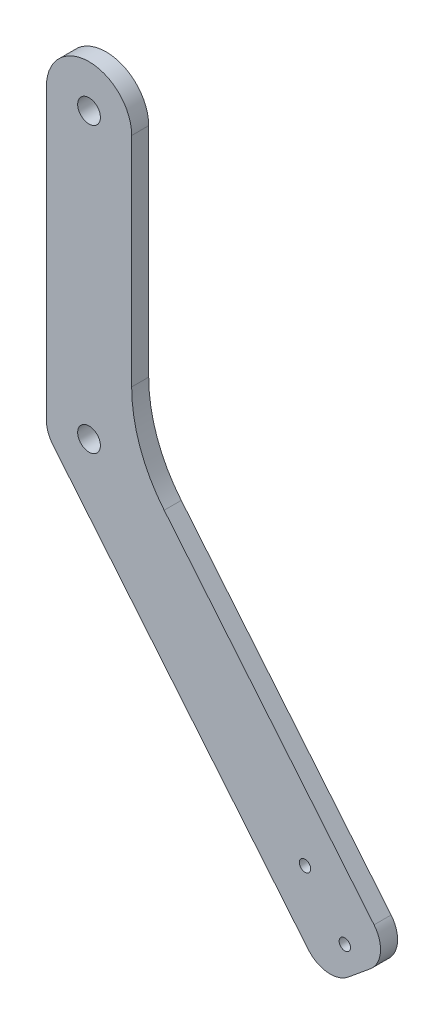
ISO-10303-21;
HEADER;
FILE_DESCRIPTION(('STEP AP214'),'2;1');
FILE_NAME('part.step','',(''),(''),'','','');
FILE_SCHEMA(('AUTOMOTIVE_DESIGN { 1 0 10303 214 1 1 1 1 }'));
ENDSEC;
DATA;
#1=APPLICATION_CONTEXT('core data for automotive mechanical design processes');
#2=APPLICATION_PROTOCOL_DEFINITION('international standard','automotive_design',2000,#1);
#3=PRODUCT_CONTEXT('',#1,'mechanical');
#4=PRODUCT('Part','Part','',(#3));
#5=PRODUCT_RELATED_PRODUCT_CATEGORY('part','',(#4));
#6=PRODUCT_DEFINITION_FORMATION('','',#4);
#7=PRODUCT_DEFINITION_CONTEXT('part definition',#1,'design');
#8=PRODUCT_DEFINITION('design','',#6,#7);
#9=PRODUCT_DEFINITION_SHAPE('','',#8);
#10=(LENGTH_UNIT() NAMED_UNIT(*) SI_UNIT(.MILLI.,.METRE.));
#11=(NAMED_UNIT(*) PLANE_ANGLE_UNIT() SI_UNIT($,.RADIAN.));
#12=(NAMED_UNIT(*) SI_UNIT($,.STERADIAN.) SOLID_ANGLE_UNIT());
#13=UNCERTAINTY_MEASURE_WITH_UNIT(LENGTH_MEASURE(1.E-05),#10,'distance_accuracy_value','');
#14=(GEOMETRIC_REPRESENTATION_CONTEXT(3) GLOBAL_UNCERTAINTY_ASSIGNED_CONTEXT((#13)) GLOBAL_UNIT_ASSIGNED_CONTEXT((#10,
#11,#12)) REPRESENTATION_CONTEXT('',''));
#15=CARTESIAN_POINT('',(0.,0.,0.));
#16=DIRECTION('',(0.,0.,1.));
#17=DIRECTION('',(1.,0.,0.));
#18=AXIS2_PLACEMENT_3D('',#15,#16,#17);
#19=CARTESIAN_POINT('',(0.,100.,3.));
#20=DIRECTION('',(0.,0.,-1.));
#21=DIRECTION('',(-1.,0.,0.));
#22=AXIS2_PLACEMENT_3D('',#19,#20,#21);
#23=CYLINDRICAL_SURFACE('',#22,15.);
#24=DIRECTION('',(0.,0.,-1.));
#25=VECTOR('',#24,1.);
#26=CARTESIAN_POINT('',(-15.,100.,3.));
#27=LINE('',#26,#25);
#28=CARTESIAN_POINT('',(-15.,100.,3.));
#29=VERTEX_POINT('',#28);
#30=CARTESIAN_POINT('',(-15.,100.,-3.));
#31=VERTEX_POINT('',#30);
#32=EDGE_CURVE('E126',#29,#31,#27,.T.);
#33=ORIENTED_EDGE('',*,*,#32,.F.);
#34=CARTESIAN_POINT('',(0.,100.,3.));
#35=DIRECTION('',(0.,0.,-1.));
#36=DIRECTION('',(-1.,0.,0.));
#37=AXIS2_PLACEMENT_3D('',#34,#35,#36);
#38=CIRCLE('',#37,15.);
#39=CARTESIAN_POINT('',(15.,100.,3.));
#40=VERTEX_POINT('',#39);
#41=EDGE_CURVE('E133',#40,#29,#38,.F.);
#42=ORIENTED_EDGE('',*,*,#41,.F.);
#43=DIRECTION('',(0.,0.,-1.));
#44=VECTOR('',#43,1.);
#45=CARTESIAN_POINT('',(15.,100.,3.));
#46=LINE('',#45,#44);
#47=CARTESIAN_POINT('',(15.,100.,-3.));
#48=VERTEX_POINT('',#47);
#49=EDGE_CURVE('E129',#48,#40,#46,.F.);
#50=ORIENTED_EDGE('',*,*,#49,.F.);
#51=CARTESIAN_POINT('',(0.,100.,-3.));
#52=DIRECTION('',(0.,0.,-1.));
#53=DIRECTION('',(-1.,0.,0.));
#54=AXIS2_PLACEMENT_3D('',#51,#52,#53);
#55=CIRCLE('',#54,15.);
#56=EDGE_CURVE('E123',#31,#48,#55,.T.);
#57=ORIENTED_EDGE('',*,*,#56,.F.);
#58=EDGE_LOOP('',(#33,#42,#50,#57));
#59=FACE_BOUND('',#58,.T.);
#60=ADVANCED_FACE('F44',(#59),#23,.T.);
#61=CARTESIAN_POINT('',(0.,0.,3.));
#62=DIRECTION('',(0.,0.,-1.));
#63=DIRECTION('',(-1.,0.,0.));
#64=AXIS2_PLACEMENT_3D('',#61,#62,#63);
#65=PLANE('',#64);
#66=DIRECTION('',(0.771069206683124,0.636751347470154,0.));
#67=VECTOR('',#66,1.);
#68=CARTESIAN_POINT('',(106.65848433144,-105.600205114006,3.));
#69=LINE('',#68,#67);
#70=CARTESIAN_POINT('',(91.2371001977772,-118.335232063409,3.));
#71=VERTEX_POINT('',#70);
#72=CARTESIAN_POINT('',(98.9477922646084,-111.967718588707,3.));
#73=VERTEX_POINT('',#72);
#74=EDGE_CURVE('E143',#71,#73,#69,.T.);
#75=ORIENTED_EDGE('',*,*,#74,.T.);
#76=CARTESIAN_POINT('',(92.5802787899069,-104.257026521876,3.));
#77=DIRECTION('',(0.,0.,-1.));
#78=DIRECTION('',(-1.,0.,0.));
#79=AXIS2_PLACEMENT_3D('',#76,#77,#78);
#80=CIRCLE('',#79,10.);
#81=CARTESIAN_POINT('',(100.290970856738,-97.8895130471743,3.));
#82=VERTEX_POINT('',#81);
#83=EDGE_CURVE('E194',#73,#82,#80,.F.);
#84=ORIENTED_EDGE('',*,*,#83,.T.);
#85=DIRECTION('',(-0.636751347470154,0.771069206683124,0.));
#86=VECTOR('',#85,1.);
#87=CARTESIAN_POINT('',(15.,5.39294013808743,3.));
#88=LINE('',#87,#86);
#89=CARTESIAN_POINT('',(26.4465396658438,-8.46816010846177,3.));
#90=VERTEX_POINT('',#89);
#91=EDGE_CURVE('E164',#82,#90,#88,.T.);
#92=ORIENTED_EDGE('',*,*,#91,.T.);
#93=CARTESIAN_POINT('',(65.,23.369407265046,3.));
#94=DIRECTION('',(0.,0.,-1.));
#95=DIRECTION('',(-1.,0.,0.));
#96=AXIS2_PLACEMENT_3D('',#93,#94,#95);
#97=CIRCLE('',#96,50.);
#98=CARTESIAN_POINT('',(15.,23.369407265046,3.));
#99=VERTEX_POINT('',#98);
#100=EDGE_CURVE('E11',#90,#99,#97,.T.);
#101=ORIENTED_EDGE('',*,*,#100,.T.);
#102=DIRECTION('',(0.,1.,0.));
#103=VECTOR('',#102,1.);
#104=CARTESIAN_POINT('',(15.,115.,3.));
#105=LINE('',#104,#103);
#106=EDGE_CURVE('E222',#99,#40,#105,.T.);
#107=ORIENTED_EDGE('',*,*,#106,.T.);
#108=ORIENTED_EDGE('',*,*,#41,.T.);
#109=DIRECTION('',(0.,-1.,0.));
#110=VECTOR('',#109,1.);
#111=CARTESIAN_POINT('',(-15.,-5.39294013808746,3.));
#112=LINE('',#111,#110);
#113=CARTESIAN_POINT('',(-15.,-1.79764671269576,3.));
#114=VERTEX_POINT('',#113);
#115=EDGE_CURVE('E141',#29,#114,#112,.T.);
#116=ORIENTED_EDGE('',*,*,#115,.T.);
#117=CARTESIAN_POINT('',(-5.00000000000002,-1.79764671269576,3.));
#118=DIRECTION('',(0.,0.,-1.));
#119=DIRECTION('',(-1.,0.,0.));
#120=AXIS2_PLACEMENT_3D('',#117,#118,#119);
#121=CIRCLE('',#120,10.);
#122=CARTESIAN_POINT('',(-12.7106920668312,-8.16516018739734,3.));
#123=VERTEX_POINT('',#122);
#124=EDGE_CURVE('E188',#114,#123,#121,.F.);
#125=ORIENTED_EDGE('',*,*,#124,.T.);
#126=DIRECTION('',(0.636751347470154,-0.771069206683125,0.));
#127=VECTOR('',#126,1.);
#128=CARTESIAN_POINT('',(83.526408130946,-124.70274553811,3.));
#129=LINE('',#128,#127);
#130=CARTESIAN_POINT('',(77.1588946562444,-116.992053471279,3.));
#131=VERTEX_POINT('',#130);
#132=EDGE_CURVE('E216',#123,#131,#129,.T.);
#133=ORIENTED_EDGE('',*,*,#132,.T.);
#134=CARTESIAN_POINT('',(84.8695867230757,-110.624539996577,3.));
#135=DIRECTION('',(0.,0.,-1.));
#136=DIRECTION('',(-1.,0.,0.));
#137=AXIS2_PLACEMENT_3D('',#134,#135,#136);
#138=CIRCLE('',#137,10.);
#139=EDGE_CURVE('E191',#131,#71,#138,.F.);
#140=ORIENTED_EDGE('',*,*,#139,.T.);
#141=EDGE_LOOP('',(#75,#84,#92,#101,#107,#108,#116,#125,#133,#140));
#142=FACE_BOUND('',#141,.T.);
#143=CARTESIAN_POINT('',(0.,100.,3.));
#144=DIRECTION('',(0.,0.,1.));
#145=DIRECTION('',(1.,0.,0.));
#146=AXIS2_PLACEMENT_3D('',#143,#144,#145);
#147=CIRCLE('',#146,4.);
#148=CARTESIAN_POINT('',(3.99999999999999,100.,3.));
#149=VERTEX_POINT('',#148);
#150=EDGE_CURVE('E233',#149,#149,#147,.T.);
#151=ORIENTED_EDGE('',*,*,#150,.F.);
#152=EDGE_LOOP('',(#151));
#153=FACE_BOUND('',#152,.T.);
#154=CARTESIAN_POINT('',(0.,0.,3.));
#155=DIRECTION('',(0.,0.,1.));
#156=DIRECTION('',(1.,0.,0.));
#157=AXIS2_PLACEMENT_3D('',#154,#155,#156);
#158=CIRCLE('',#157,4.);
#159=CARTESIAN_POINT('',(4.,0.,3.));
#160=VERTEX_POINT('',#159);
#161=EDGE_CURVE('E240',#160,#160,#158,.T.);
#162=ORIENTED_EDGE('',*,*,#161,.F.);
#163=EDGE_LOOP('',(#162));
#164=FACE_BOUND('',#163,.T.);
#165=CARTESIAN_POINT('',(75.9899058070882,-92.0193991255641,3.));
#166=DIRECTION('',(0.,0.,1.));
#167=DIRECTION('',(1.,0.,0.));
#168=AXIS2_PLACEMENT_3D('',#165,#166,#167);
#169=CIRCLE('',#168,2.);
#170=CARTESIAN_POINT('',(77.9899058070882,-92.0193991255641,3.));
#171=VERTEX_POINT('',#170);
#172=EDGE_CURVE('E246',#171,#171,#169,.T.);
#173=ORIENTED_EDGE('',*,*,#172,.F.);
#174=EDGE_LOOP('',(#173));
#175=FACE_BOUND('',#174,.T.);
#176=CARTESIAN_POINT('',(89.9984354514316,-108.982921672593,3.));
#177=DIRECTION('',(0.,0.,1.));
#178=DIRECTION('',(1.,0.,0.));
#179=AXIS2_PLACEMENT_3D('',#176,#177,#178);
#180=CIRCLE('',#179,2.);
#181=CARTESIAN_POINT('',(91.9984354514316,-108.982921672593,3.));
#182=VERTEX_POINT('',#181);
#183=EDGE_CURVE('E254',#182,#182,#180,.T.);
#184=ORIENTED_EDGE('',*,*,#183,.F.);
#185=EDGE_LOOP('',(#184));
#186=FACE_BOUND('',#185,.T.);
#187=ADVANCED_FACE('F269',(#142,#153,#164,#175,#186),#65,.F.);
#188=CARTESIAN_POINT('',(0.,0.,-3.));
#189=DIRECTION('',(0.,0.,-1.));
#190=DIRECTION('',(-1.,0.,0.));
#191=AXIS2_PLACEMENT_3D('',#188,#189,#190);
#192=PLANE('',#191);
#193=CARTESIAN_POINT('',(75.9899058070882,-92.0193991255641,-3.));
#194=DIRECTION('',(0.,0.,1.));
#195=DIRECTION('',(1.,0.,0.));
#196=AXIS2_PLACEMENT_3D('',#193,#194,#195);
#197=CIRCLE('',#196,2.);
#198=CARTESIAN_POINT('',(77.9899058070882,-92.0193991255641,-3.));
#199=VERTEX_POINT('',#198);
#200=EDGE_CURVE('E250',#199,#199,#197,.T.);
#201=ORIENTED_EDGE('',*,*,#200,.T.);
#202=EDGE_LOOP('',(#201));
#203=FACE_BOUND('',#202,.T.);
#204=CARTESIAN_POINT('',(0.,100.,-3.));
#205=DIRECTION('',(0.,0.,1.));
#206=DIRECTION('',(1.,0.,0.));
#207=AXIS2_PLACEMENT_3D('',#204,#205,#206);
#208=CIRCLE('',#207,4.);
#209=CARTESIAN_POINT('',(3.99999999999999,100.,-3.));
#210=VERTEX_POINT('',#209);
#211=EDGE_CURVE('E230',#210,#210,#208,.T.);
#212=ORIENTED_EDGE('',*,*,#211,.T.);
#213=EDGE_LOOP('',(#212));
#214=FACE_BOUND('',#213,.T.);
#215=DIRECTION('',(-0.636751347470154,0.771069206683124,0.));
#216=VECTOR('',#215,1.);
#217=CARTESIAN_POINT('',(15.,5.39294013808743,-3.));
#218=LINE('',#217,#216);
#219=CARTESIAN_POINT('',(100.290970856738,-97.8895130471743,-3.));
#220=VERTEX_POINT('',#219);
#221=CARTESIAN_POINT('',(26.4465396658438,-8.46816010846177,-3.));
#222=VERTEX_POINT('',#221);
#223=EDGE_CURVE('E158',#220,#222,#218,.T.);
#224=ORIENTED_EDGE('',*,*,#223,.F.);
#225=CARTESIAN_POINT('',(92.5802787899069,-104.257026521876,-3.));
#226=DIRECTION('',(0.,0.,-1.));
#227=DIRECTION('',(-1.,0.,0.));
#228=AXIS2_PLACEMENT_3D('',#225,#226,#227);
#229=CIRCLE('',#228,10.);
#230=CARTESIAN_POINT('',(98.9477922646084,-111.967718588707,-3.));
#231=VERTEX_POINT('',#230);
#232=EDGE_CURVE('E178',#220,#231,#229,.T.);
#233=ORIENTED_EDGE('',*,*,#232,.T.);
#234=DIRECTION('',(0.771069206683124,0.636751347470154,0.));
#235=VECTOR('',#234,1.);
#236=CARTESIAN_POINT('',(106.65848433144,-105.600205114006,-3.));
#237=LINE('',#236,#235);
#238=CARTESIAN_POINT('',(91.2371001977772,-118.335232063409,-3.));
#239=VERTEX_POINT('',#238);
#240=EDGE_CURVE('E156',#239,#231,#237,.T.);
#241=ORIENTED_EDGE('',*,*,#240,.F.);
#242=CARTESIAN_POINT('',(84.8695867230757,-110.624539996577,-3.));
#243=DIRECTION('',(0.,0.,-1.));
#244=DIRECTION('',(-1.,0.,0.));
#245=AXIS2_PLACEMENT_3D('',#242,#243,#244);
#246=CIRCLE('',#245,10.);
#247=CARTESIAN_POINT('',(77.1588946562444,-116.992053471279,-3.));
#248=VERTEX_POINT('',#247);
#249=EDGE_CURVE('E175',#239,#248,#246,.T.);
#250=ORIENTED_EDGE('',*,*,#249,.T.);
#251=DIRECTION('',(0.636751347470154,-0.771069206683125,0.));
#252=VECTOR('',#251,1.);
#253=CARTESIAN_POINT('',(83.526408130946,-124.70274553811,-3.));
#254=LINE('',#253,#252);
#255=CARTESIAN_POINT('',(-12.7106920668312,-8.16516018739734,-3.));
#256=VERTEX_POINT('',#255);
#257=EDGE_CURVE('E150',#256,#248,#254,.T.);
#258=ORIENTED_EDGE('',*,*,#257,.F.);
#259=CARTESIAN_POINT('',(-5.00000000000002,-1.79764671269576,-3.));
#260=DIRECTION('',(0.,0.,-1.));
#261=DIRECTION('',(-1.,0.,0.));
#262=AXIS2_PLACEMENT_3D('',#259,#260,#261);
#263=CIRCLE('',#262,10.);
#264=CARTESIAN_POINT('',(-15.,-1.79764671269576,-3.));
#265=VERTEX_POINT('',#264);
#266=EDGE_CURVE('E148',#256,#265,#263,.T.);
#267=ORIENTED_EDGE('',*,*,#266,.T.);
#268=DIRECTION('',(0.,-1.,0.));
#269=VECTOR('',#268,1.);
#270=CARTESIAN_POINT('',(-15.,-5.39294013808746,-3.));
#271=LINE('',#270,#269);
#272=EDGE_CURVE('E138',#31,#265,#271,.T.);
#273=ORIENTED_EDGE('',*,*,#272,.F.);
#274=ORIENTED_EDGE('',*,*,#56,.T.);
#275=DIRECTION('',(0.,1.,0.));
#276=VECTOR('',#275,1.);
#277=CARTESIAN_POINT('',(15.,115.,-3.));
#278=LINE('',#277,#276);
#279=CARTESIAN_POINT('',(15.,23.369407265046,-3.));
#280=VERTEX_POINT('',#279);
#281=EDGE_CURVE('E151',#280,#48,#278,.T.);
#282=ORIENTED_EDGE('',*,*,#281,.F.);
#283=CARTESIAN_POINT('',(65.,23.369407265046,-3.));
#284=DIRECTION('',(0.,0.,-1.));
#285=DIRECTION('',(-1.,0.,0.));
#286=AXIS2_PLACEMENT_3D('',#283,#284,#285);
#287=CIRCLE('',#286,50.);
#288=EDGE_CURVE('E53',#280,#222,#287,.F.);
#289=ORIENTED_EDGE('',*,*,#288,.T.);
#290=EDGE_LOOP('',(#224,#233,#241,#250,#258,#267,#273,#274,#282,#289));
#291=FACE_BOUND('',#290,.T.);
#292=CARTESIAN_POINT('',(0.,0.,-3.));
#293=DIRECTION('',(0.,0.,1.));
#294=DIRECTION('',(1.,0.,0.));
#295=AXIS2_PLACEMENT_3D('',#292,#293,#294);
#296=CIRCLE('',#295,4.);
#297=CARTESIAN_POINT('',(4.,0.,-3.));
#298=VERTEX_POINT('',#297);
#299=EDGE_CURVE('E242',#298,#298,#296,.T.);
#300=ORIENTED_EDGE('',*,*,#299,.T.);
#301=EDGE_LOOP('',(#300));
#302=FACE_BOUND('',#301,.T.);
#303=CARTESIAN_POINT('',(89.9984354514316,-108.982921672593,-3.));
#304=DIRECTION('',(0.,0.,1.));
#305=DIRECTION('',(1.,0.,0.));
#306=AXIS2_PLACEMENT_3D('',#303,#304,#305);
#307=CIRCLE('',#306,2.);
#308=CARTESIAN_POINT('',(91.9984354514316,-108.982921672593,-3.));
#309=VERTEX_POINT('',#308);
#310=EDGE_CURVE('E258',#309,#309,#307,.T.);
#311=ORIENTED_EDGE('',*,*,#310,.T.);
#312=EDGE_LOOP('',(#311));
#313=FACE_BOUND('',#312,.T.);
#314=ADVANCED_FACE('F145',(#203,#214,#291,#302,#313),#192,.T.);
#315=CARTESIAN_POINT('',(15.,5.39294013808743,3.));
#316=DIRECTION('',(-0.771069206683124,-0.636751347470154,0.));
#317=DIRECTION('',(0.636751347470154,-0.771069206683125,0.));
#318=AXIS2_PLACEMENT_3D('',#315,#316,#317);
#319=PLANE('',#318);
#320=ORIENTED_EDGE('',*,*,#223,.T.);
#321=DIRECTION('',(0.,0.,-1.));
#322=VECTOR('',#321,1.);
#323=CARTESIAN_POINT('',(26.4465396658438,-8.46816010846177,3.));
#324=LINE('',#323,#322);
#325=EDGE_CURVE('E66',#222,#90,#324,.F.);
#326=ORIENTED_EDGE('',*,*,#325,.T.);
#327=ORIENTED_EDGE('',*,*,#91,.F.);
#328=DIRECTION('',(0.,0.,-1.));
#329=VECTOR('',#328,1.);
#330=CARTESIAN_POINT('',(100.290970856738,-97.8895130471743,3.));
#331=LINE('',#330,#329);
#332=EDGE_CURVE('E132',#82,#220,#331,.T.);
#333=ORIENTED_EDGE('',*,*,#332,.T.);
#334=EDGE_LOOP('',(#320,#326,#327,#333));
#335=FACE_BOUND('',#334,.T.);
#336=ADVANCED_FACE('F276',(#335),#319,.F.);
#337=CARTESIAN_POINT('',(15.,115.,3.));
#338=DIRECTION('',(-1.,0.,0.));
#339=DIRECTION('',(0.,-1.,0.));
#340=AXIS2_PLACEMENT_3D('',#337,#338,#339);
#341=PLANE('',#340);
#342=ORIENTED_EDGE('',*,*,#106,.F.);
#343=DIRECTION('',(0.,0.,-1.));
#344=VECTOR('',#343,1.);
#345=CARTESIAN_POINT('',(15.,23.3694072650459,-3.));
#346=LINE('',#345,#344);
#347=EDGE_CURVE('E207',#99,#280,#346,.T.);
#348=ORIENTED_EDGE('',*,*,#347,.T.);
#349=ORIENTED_EDGE('',*,*,#281,.T.);
#350=ORIENTED_EDGE('',*,*,#49,.T.);
#351=EDGE_LOOP('',(#342,#348,#349,#350));
#352=FACE_BOUND('',#351,.T.);
#353=ADVANCED_FACE('F295',(#352),#341,.F.);
#354=CARTESIAN_POINT('',(-15.,-5.39294013808746,3.));
#355=DIRECTION('',(1.,0.,0.));
#356=DIRECTION('',(0.,1.,0.));
#357=AXIS2_PLACEMENT_3D('',#354,#355,#356);
#358=PLANE('',#357);
#359=ORIENTED_EDGE('',*,*,#272,.T.);
#360=DIRECTION('',(0.,0.,-1.));
#361=VECTOR('',#360,1.);
#362=CARTESIAN_POINT('',(-15.,-1.79764671269576,3.));
#363=LINE('',#362,#361);
#364=EDGE_CURVE('E204',#265,#114,#363,.F.);
#365=ORIENTED_EDGE('',*,*,#364,.T.);
#366=ORIENTED_EDGE('',*,*,#115,.F.);
#367=ORIENTED_EDGE('',*,*,#32,.T.);
#368=EDGE_LOOP('',(#359,#365,#366,#367));
#369=FACE_BOUND('',#368,.T.);
#370=ADVANCED_FACE('F137',(#369),#358,.F.);
#371=CARTESIAN_POINT('',(83.526408130946,-124.70274553811,3.));
#372=DIRECTION('',(0.771069206683125,0.636751347470154,0.));
#373=DIRECTION('',(-0.636751347470154,0.771069206683125,0.));
#374=AXIS2_PLACEMENT_3D('',#371,#372,#373);
#375=PLANE('',#374);
#376=ORIENTED_EDGE('',*,*,#257,.T.);
#377=DIRECTION('',(0.,0.,-1.));
#378=VECTOR('',#377,1.);
#379=CARTESIAN_POINT('',(77.1588946562444,-116.992053471279,3.));
#380=LINE('',#379,#378);
#381=EDGE_CURVE('E201',#248,#131,#380,.F.);
#382=ORIENTED_EDGE('',*,*,#381,.T.);
#383=ORIENTED_EDGE('',*,*,#132,.F.);
#384=DIRECTION('',(0.,0.,-1.));
#385=VECTOR('',#384,1.);
#386=CARTESIAN_POINT('',(-12.7106920668313,-8.16516018739727,3.));
#387=LINE('',#386,#385);
#388=EDGE_CURVE('E197',#123,#256,#387,.T.);
#389=ORIENTED_EDGE('',*,*,#388,.T.);
#390=EDGE_LOOP('',(#376,#382,#383,#389));
#391=FACE_BOUND('',#390,.T.);
#392=ADVANCED_FACE('F288',(#391),#375,.F.);
#393=CARTESIAN_POINT('',(106.65848433144,-105.600205114006,3.));
#394=DIRECTION('',(-0.636751347470154,0.771069206683124,0.));
#395=DIRECTION('',(-0.771069206683124,-0.636751347470154,0.));
#396=AXIS2_PLACEMENT_3D('',#393,#394,#395);
#397=PLANE('',#396);
#398=ORIENTED_EDGE('',*,*,#240,.T.);
#399=DIRECTION('',(0.,0.,-1.));
#400=VECTOR('',#399,1.);
#401=CARTESIAN_POINT('',(98.9477922646084,-111.967718588707,3.));
#402=LINE('',#401,#400);
#403=EDGE_CURVE('E185',#231,#73,#402,.F.);
#404=ORIENTED_EDGE('',*,*,#403,.T.);
#405=ORIENTED_EDGE('',*,*,#74,.F.);
#406=DIRECTION('',(0.,0.,-1.));
#407=VECTOR('',#406,1.);
#408=CARTESIAN_POINT('',(91.2371001977772,-118.335232063409,3.));
#409=LINE('',#408,#407);
#410=EDGE_CURVE('E181',#71,#239,#409,.T.);
#411=ORIENTED_EDGE('',*,*,#410,.T.);
#412=EDGE_LOOP('',(#398,#404,#405,#411));
#413=FACE_BOUND('',#412,.T.);
#414=ADVANCED_FACE('F285',(#413),#397,.F.);
#415=CARTESIAN_POINT('',(0.,100.,3.));
#416=DIRECTION('',(0.,0.,-1.));
#417=DIRECTION('',(-1.,0.,0.));
#418=AXIS2_PLACEMENT_3D('',#415,#416,#417);
#419=CYLINDRICAL_SURFACE('',#418,4.);
#420=ORIENTED_EDGE('',*,*,#150,.T.);
#421=EDGE_LOOP('',(#420));
#422=FACE_BOUND('',#421,.T.);
#423=ORIENTED_EDGE('',*,*,#211,.F.);
#424=EDGE_LOOP('',(#423));
#425=FACE_BOUND('',#424,.T.);
#426=ADVANCED_FACE('F282',(#422,#425),#419,.F.);
#427=CARTESIAN_POINT('',(0.,0.,3.));
#428=DIRECTION('',(0.,0.,-1.));
#429=DIRECTION('',(-1.,0.,0.));
#430=AXIS2_PLACEMENT_3D('',#427,#428,#429);
#431=CYLINDRICAL_SURFACE('',#430,4.);
#432=ORIENTED_EDGE('',*,*,#161,.T.);
#433=EDGE_LOOP('',(#432));
#434=FACE_BOUND('',#433,.T.);
#435=ORIENTED_EDGE('',*,*,#299,.F.);
#436=EDGE_LOOP('',(#435));
#437=FACE_BOUND('',#436,.T.);
#438=ADVANCED_FACE('F427',(#434,#437),#431,.F.);
#439=CARTESIAN_POINT('',(75.9899058070882,-92.0193991255641,3.));
#440=DIRECTION('',(0.,0.,-1.));
#441=DIRECTION('',(-1.,0.,0.));
#442=AXIS2_PLACEMENT_3D('',#439,#440,#441);
#443=CYLINDRICAL_SURFACE('',#442,2.);
#444=ORIENTED_EDGE('',*,*,#172,.T.);
#445=EDGE_LOOP('',(#444));
#446=FACE_BOUND('',#445,.T.);
#447=ORIENTED_EDGE('',*,*,#200,.F.);
#448=EDGE_LOOP('',(#447));
#449=FACE_BOUND('',#448,.T.);
#450=ADVANCED_FACE('F417',(#446,#449),#443,.F.);
#451=CARTESIAN_POINT('',(89.9984354514316,-108.982921672593,3.));
#452=DIRECTION('',(0.,0.,-1.));
#453=DIRECTION('',(-1.,0.,0.));
#454=AXIS2_PLACEMENT_3D('',#451,#452,#453);
#455=CYLINDRICAL_SURFACE('',#454,2.);
#456=ORIENTED_EDGE('',*,*,#183,.T.);
#457=EDGE_LOOP('',(#456));
#458=FACE_BOUND('',#457,.T.);
#459=ORIENTED_EDGE('',*,*,#310,.F.);
#460=EDGE_LOOP('',(#459));
#461=FACE_BOUND('',#460,.T.);
#462=ADVANCED_FACE('F266',(#458,#461),#455,.F.);
#463=CARTESIAN_POINT('',(92.5802787899069,-104.257026521876,3.));
#464=DIRECTION('',(0.,0.,-1.));
#465=DIRECTION('',(-1.,0.,0.));
#466=AXIS2_PLACEMENT_3D('',#463,#464,#465);
#467=CYLINDRICAL_SURFACE('',#466,10.);
#468=ORIENTED_EDGE('',*,*,#83,.F.);
#469=ORIENTED_EDGE('',*,*,#403,.F.);
#470=ORIENTED_EDGE('',*,*,#232,.F.);
#471=ORIENTED_EDGE('',*,*,#332,.F.);
#472=EDGE_LOOP('',(#468,#469,#470,#471));
#473=FACE_BOUND('',#472,.T.);
#474=ADVANCED_FACE('F304',(#473),#467,.T.);
#475=CARTESIAN_POINT('',(84.8695867230757,-110.624539996577,3.));
#476=DIRECTION('',(0.,0.,-1.));
#477=DIRECTION('',(-1.,0.,0.));
#478=AXIS2_PLACEMENT_3D('',#475,#476,#477);
#479=CYLINDRICAL_SURFACE('',#478,10.);
#480=ORIENTED_EDGE('',*,*,#139,.F.);
#481=ORIENTED_EDGE('',*,*,#381,.F.);
#482=ORIENTED_EDGE('',*,*,#249,.F.);
#483=ORIENTED_EDGE('',*,*,#410,.F.);
#484=EDGE_LOOP('',(#480,#481,#482,#483));
#485=FACE_BOUND('',#484,.T.);
#486=ADVANCED_FACE('F307',(#485),#479,.T.);
#487=CARTESIAN_POINT('',(-5.00000000000002,-1.79764671269576,3.));
#488=DIRECTION('',(0.,0.,-1.));
#489=DIRECTION('',(-1.,0.,0.));
#490=AXIS2_PLACEMENT_3D('',#487,#488,#489);
#491=CYLINDRICAL_SURFACE('',#490,10.);
#492=ORIENTED_EDGE('',*,*,#124,.F.);
#493=ORIENTED_EDGE('',*,*,#364,.F.);
#494=ORIENTED_EDGE('',*,*,#266,.F.);
#495=ORIENTED_EDGE('',*,*,#388,.F.);
#496=EDGE_LOOP('',(#492,#493,#494,#495));
#497=FACE_BOUND('',#496,.T.);
#498=ADVANCED_FACE('F310',(#497),#491,.T.);
#499=CARTESIAN_POINT('',(65.,23.369407265046,3.));
#500=DIRECTION('',(0.,0.,1.));
#501=DIRECTION('',(1.,0.,0.));
#502=AXIS2_PLACEMENT_3D('',#499,#500,#501);
#503=CYLINDRICAL_SURFACE('',#502,50.);
#504=ORIENTED_EDGE('',*,*,#100,.F.);
#505=ORIENTED_EDGE('',*,*,#325,.F.);
#506=ORIENTED_EDGE('',*,*,#288,.F.);
#507=ORIENTED_EDGE('',*,*,#347,.F.);
#508=EDGE_LOOP('',(#504,#505,#506,#507));
#509=FACE_BOUND('',#508,.T.);
#510=ADVANCED_FACE('F46',(#509),#503,.F.);
#511=CLOSED_SHELL('',(#60,#187,#314,#336,#353,#370,#392,#414,#426,#438,#450,#462,#474,#486,#498,#510));
#512=MANIFOLD_SOLID_BREP('B2',#511);
#513=ADVANCED_BREP_SHAPE_REPRESENTATION('',(#18,#512),#14);
#514=SHAPE_DEFINITION_REPRESENTATION(#9,#513);
ENDSEC;
END-ISO-10303-21;
